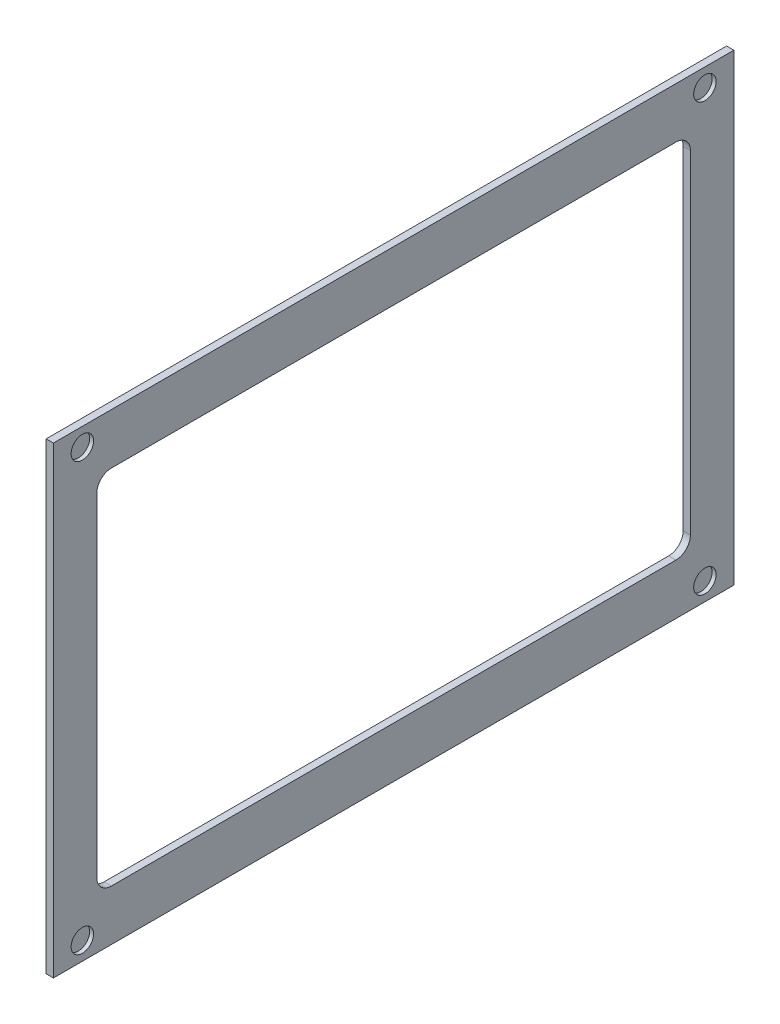
ISO-10303-21;
HEADER;
FILE_DESCRIPTION(('STEP AP214'),'2;1');
FILE_NAME('part.step','',(''),(''),'','','');
FILE_SCHEMA(('AUTOMOTIVE_DESIGN { 1 0 10303 214 1 1 1 1 }'));
ENDSEC;
DATA;
#1=APPLICATION_CONTEXT('core data for automotive mechanical design processes');
#2=APPLICATION_PROTOCOL_DEFINITION('international standard','automotive_design',2000,#1);
#3=PRODUCT_CONTEXT('',#1,'mechanical');
#4=PRODUCT('Part','Part','',(#3));
#5=PRODUCT_RELATED_PRODUCT_CATEGORY('part','',(#4));
#6=PRODUCT_DEFINITION_FORMATION('','',#4);
#7=PRODUCT_DEFINITION_CONTEXT('part definition',#1,'design');
#8=PRODUCT_DEFINITION('design','',#6,#7);
#9=PRODUCT_DEFINITION_SHAPE('','',#8);
#10=(LENGTH_UNIT() NAMED_UNIT(*) SI_UNIT(.MILLI.,.METRE.));
#11=(NAMED_UNIT(*) PLANE_ANGLE_UNIT() SI_UNIT($,.RADIAN.));
#12=(NAMED_UNIT(*) SI_UNIT($,.STERADIAN.) SOLID_ANGLE_UNIT());
#13=UNCERTAINTY_MEASURE_WITH_UNIT(LENGTH_MEASURE(1.E-05),#10,'distance_accuracy_value','');
#14=(GEOMETRIC_REPRESENTATION_CONTEXT(3) GLOBAL_UNCERTAINTY_ASSIGNED_CONTEXT((#13)) GLOBAL_UNIT_ASSIGNED_CONTEXT((#10,
#11,#12)) REPRESENTATION_CONTEXT('',''));
#15=CARTESIAN_POINT('',(0.,0.,0.));
#16=DIRECTION('',(0.,0.,1.));
#17=DIRECTION('',(1.,0.,0.));
#18=AXIS2_PLACEMENT_3D('',#15,#16,#17);
#19=CARTESIAN_POINT('',(2.,102.239203456617,133.672025675722));
#20=DIRECTION('',(0.,0.,-1.));
#21=DIRECTION('',(-1.,0.,0.));
#22=AXIS2_PLACEMENT_3D('',#19,#20,#21);
#23=PLANE('',#22);
#24=DIRECTION('',(0.,-1.,0.));
#25=VECTOR('',#24,1.);
#26=CARTESIAN_POINT('',(0.,102.239203456617,133.672025675722));
#27=LINE('',#26,#25);
#28=CARTESIAN_POINT('',(0.,102.239203456617,133.672025675722));
#29=VERTEX_POINT('',#28);
#30=CARTESIAN_POINT('',(0.,-25.7607965433831,133.672025675722));
#31=VERTEX_POINT('',#30);
#32=EDGE_CURVE('E149',#29,#31,#27,.T.);
#33=ORIENTED_EDGE('',*,*,#32,.T.);
#34=DIRECTION('',(-1.,0.,0.));
#35=VECTOR('',#34,1.);
#36=CARTESIAN_POINT('',(2.,-25.7607965433831,133.672025675722));
#37=LINE('',#36,#35);
#38=CARTESIAN_POINT('',(2.,-25.7607965433831,133.672025675722));
#39=VERTEX_POINT('',#38);
#40=EDGE_CURVE('E130',#39,#31,#37,.T.);
#41=ORIENTED_EDGE('',*,*,#40,.F.);
#42=DIRECTION('',(0.,-1.,0.));
#43=VECTOR('',#42,1.);
#44=CARTESIAN_POINT('',(2.,102.239203456617,133.672025675722));
#45=LINE('',#44,#43);
#46=CARTESIAN_POINT('',(2.,102.239203456617,133.672025675722));
#47=VERTEX_POINT('',#46);
#48=EDGE_CURVE('E137',#47,#39,#45,.T.);
#49=ORIENTED_EDGE('',*,*,#48,.F.);
#50=DIRECTION('',(-1.,0.,0.));
#51=VECTOR('',#50,1.);
#52=CARTESIAN_POINT('',(2.,102.239203456617,133.672025675722));
#53=LINE('',#52,#51);
#54=EDGE_CURVE('E271',#47,#29,#53,.T.);
#55=ORIENTED_EDGE('',*,*,#54,.T.);
#56=EDGE_LOOP('',(#33,#41,#49,#55));
#57=FACE_BOUND('',#56,.T.);
#58=ADVANCED_FACE('F37',(#57),#23,.F.);
#59=CARTESIAN_POINT('',(2.,-25.7607965433831,133.672025675722));
#60=DIRECTION('',(0.,1.,0.));
#61=DIRECTION('',(0.,0.,1.));
#62=AXIS2_PLACEMENT_3D('',#59,#60,#61);
#63=PLANE('',#62);
#64=DIRECTION('',(0.,0.,-1.));
#65=VECTOR('',#64,1.);
#66=CARTESIAN_POINT('',(0.,-25.7607965433831,133.672025675722));
#67=LINE('',#66,#65);
#68=CARTESIAN_POINT('',(0.,-25.7607965433831,-54.3279743242773));
#69=VERTEX_POINT('',#68);
#70=EDGE_CURVE('E273',#31,#69,#67,.T.);
#71=ORIENTED_EDGE('',*,*,#70,.T.);
#72=DIRECTION('',(-1.,0.,0.));
#73=VECTOR('',#72,1.);
#74=CARTESIAN_POINT('',(2.,-25.7607965433831,-54.3279743242773));
#75=LINE('',#74,#73);
#76=CARTESIAN_POINT('',(2.,-25.7607965433831,-54.3279743242773));
#77=VERTEX_POINT('',#76);
#78=EDGE_CURVE('E133',#77,#69,#75,.T.);
#79=ORIENTED_EDGE('',*,*,#78,.F.);
#80=DIRECTION('',(0.,0.,-1.));
#81=VECTOR('',#80,1.);
#82=CARTESIAN_POINT('',(2.,-25.7607965433831,133.672025675722));
#83=LINE('',#82,#81);
#84=EDGE_CURVE('E126',#39,#77,#83,.T.);
#85=ORIENTED_EDGE('',*,*,#84,.F.);
#86=ORIENTED_EDGE('',*,*,#40,.T.);
#87=EDGE_LOOP('',(#71,#79,#85,#86));
#88=FACE_BOUND('',#87,.T.);
#89=ADVANCED_FACE('F128',(#88),#63,.F.);
#90=CARTESIAN_POINT('',(2.,102.239203456617,-54.3279743242773));
#91=DIRECTION('',(0.,0.,1.));
#92=DIRECTION('',(0.,-1.,0.));
#93=AXIS2_PLACEMENT_3D('',#90,#91,#92);
#94=PLANE('',#93);
#95=DIRECTION('',(0.,1.,0.));
#96=VECTOR('',#95,1.);
#97=CARTESIAN_POINT('',(0.,102.239203456617,-54.3279743242773));
#98=LINE('',#97,#96);
#99=CARTESIAN_POINT('',(0.,102.239203456617,-54.3279743242773));
#100=VERTEX_POINT('',#99);
#101=EDGE_CURVE('E275',#69,#100,#98,.T.);
#102=ORIENTED_EDGE('',*,*,#101,.T.);
#103=DIRECTION('',(-1.,0.,0.));
#104=VECTOR('',#103,1.);
#105=CARTESIAN_POINT('',(2.,102.239203456617,-54.3279743242773));
#106=LINE('',#105,#104);
#107=CARTESIAN_POINT('',(2.,102.239203456617,-54.3279743242773));
#108=VERTEX_POINT('',#107);
#109=EDGE_CURVE('E154',#108,#100,#106,.T.);
#110=ORIENTED_EDGE('',*,*,#109,.F.);
#111=DIRECTION('',(0.,1.,0.));
#112=VECTOR('',#111,1.);
#113=CARTESIAN_POINT('',(2.,102.239203456617,-54.3279743242773));
#114=LINE('',#113,#112);
#115=EDGE_CURVE('E136',#77,#108,#114,.T.);
#116=ORIENTED_EDGE('',*,*,#115,.F.);
#117=ORIENTED_EDGE('',*,*,#78,.T.);
#118=EDGE_LOOP('',(#102,#110,#116,#117));
#119=FACE_BOUND('',#118,.T.);
#120=ADVANCED_FACE('F216',(#119),#94,.F.);
#121=CARTESIAN_POINT('',(2.,102.239203456617,133.672025675722));
#122=DIRECTION('',(0.,-1.,0.));
#123=DIRECTION('',(0.,0.,-1.));
#124=AXIS2_PLACEMENT_3D('',#121,#122,#123);
#125=PLANE('',#124);
#126=DIRECTION('',(0.,0.,1.));
#127=VECTOR('',#126,1.);
#128=CARTESIAN_POINT('',(0.,102.239203456617,133.672025675722));
#129=LINE('',#128,#127);
#130=EDGE_CURVE('E146',#100,#29,#129,.T.);
#131=ORIENTED_EDGE('',*,*,#130,.T.);
#132=ORIENTED_EDGE('',*,*,#54,.F.);
#133=DIRECTION('',(0.,0.,1.));
#134=VECTOR('',#133,1.);
#135=CARTESIAN_POINT('',(2.,102.239203456617,133.672025675722));
#136=LINE('',#135,#134);
#137=EDGE_CURVE('E142',#108,#47,#136,.T.);
#138=ORIENTED_EDGE('',*,*,#137,.F.);
#139=ORIENTED_EDGE('',*,*,#109,.T.);
#140=EDGE_LOOP('',(#131,#132,#138,#139));
#141=FACE_BOUND('',#140,.T.);
#142=ADVANCED_FACE('F282',(#141),#125,.F.);
#143=CARTESIAN_POINT('',(2.,0.,0.));
#144=DIRECTION('',(1.,0.,0.));
#145=DIRECTION('',(0.,0.,-1.));
#146=AXIS2_PLACEMENT_3D('',#143,#144,#145);
#147=PLANE('',#146);
#148=DIRECTION('',(0.,-1.,0.));
#149=VECTOR('',#148,1.);
#150=CARTESIAN_POINT('',(2.,0.,121.672025675722));
#151=LINE('',#150,#149);
#152=CARTESIAN_POINT('',(2.,84.2392034566169,121.672025675722));
#153=VERTEX_POINT('',#152);
#154=CARTESIAN_POINT('',(2.,-7.76079654338306,121.672025675722));
#155=VERTEX_POINT('',#154);
#156=EDGE_CURVE('E198',#153,#155,#151,.T.);
#157=ORIENTED_EDGE('',*,*,#156,.F.);
#158=CARTESIAN_POINT('',(2.,84.2392034566169,117.672025675722));
#159=DIRECTION('',(1.,0.,0.));
#160=DIRECTION('',(0.,0.,-1.));
#161=AXIS2_PLACEMENT_3D('',#158,#159,#160);
#162=CIRCLE('',#161,4.);
#163=CARTESIAN_POINT('',(2.,88.2392034566169,117.672025675722));
#164=VERTEX_POINT('',#163);
#165=EDGE_CURVE('E180',#153,#164,#162,.F.);
#166=ORIENTED_EDGE('',*,*,#165,.T.);
#167=DIRECTION('',(0.,0.,1.));
#168=VECTOR('',#167,1.);
#169=CARTESIAN_POINT('',(2.,88.2392034566169,0.));
#170=LINE('',#169,#168);
#171=CARTESIAN_POINT('',(2.,88.2392034566169,-38.3279743242773));
#172=VERTEX_POINT('',#171);
#173=EDGE_CURVE('E234',#172,#164,#170,.T.);
#174=ORIENTED_EDGE('',*,*,#173,.F.);
#175=CARTESIAN_POINT('',(2.,84.2392034566169,-38.3279743242773));
#176=DIRECTION('',(1.,0.,0.));
#177=DIRECTION('',(0.,0.,-1.));
#178=AXIS2_PLACEMENT_3D('',#175,#176,#177);
#179=CIRCLE('',#178,4.);
#180=CARTESIAN_POINT('',(2.,84.2392034566169,-42.3279743242773));
#181=VERTEX_POINT('',#180);
#182=EDGE_CURVE('E176',#172,#181,#179,.F.);
#183=ORIENTED_EDGE('',*,*,#182,.T.);
#184=DIRECTION('',(0.,1.,0.));
#185=VECTOR('',#184,1.);
#186=CARTESIAN_POINT('',(2.,0.,-42.3279743242773));
#187=LINE('',#186,#185);
#188=CARTESIAN_POINT('',(2.,-7.76079654338307,-42.3279743242773));
#189=VERTEX_POINT('',#188);
#190=EDGE_CURVE('E194',#189,#181,#187,.T.);
#191=ORIENTED_EDGE('',*,*,#190,.F.);
#192=CARTESIAN_POINT('',(2.,-7.76079654338307,-38.3279743242773));
#193=DIRECTION('',(1.,0.,0.));
#194=DIRECTION('',(0.,0.,-1.));
#195=AXIS2_PLACEMENT_3D('',#192,#193,#194);
#196=CIRCLE('',#195,4.);
#197=CARTESIAN_POINT('',(2.,-11.7607965433831,-38.3279743242773));
#198=VERTEX_POINT('',#197);
#199=EDGE_CURVE('E183',#189,#198,#196,.F.);
#200=ORIENTED_EDGE('',*,*,#199,.T.);
#201=DIRECTION('',(0.,0.,-1.));
#202=VECTOR('',#201,1.);
#203=CARTESIAN_POINT('',(2.,-11.7607965433831,0.));
#204=LINE('',#203,#202);
#205=CARTESIAN_POINT('',(2.,-11.7607965433831,117.672025675722));
#206=VERTEX_POINT('',#205);
#207=EDGE_CURVE('E191',#206,#198,#204,.T.);
#208=ORIENTED_EDGE('',*,*,#207,.F.);
#209=CARTESIAN_POINT('',(2.,-7.76079654338306,117.672025675722));
#210=DIRECTION('',(1.,0.,0.));
#211=DIRECTION('',(0.,0.,-1.));
#212=AXIS2_PLACEMENT_3D('',#209,#210,#211);
#213=CIRCLE('',#212,4.);
#214=EDGE_CURVE('E11',#206,#155,#213,.F.);
#215=ORIENTED_EDGE('',*,*,#214,.T.);
#216=EDGE_LOOP('',(#157,#166,#174,#183,#191,#200,#208,#215));
#217=FACE_BOUND('',#216,.T.);
#218=CARTESIAN_POINT('',(2.,97.2392034566169,-46.3279743242773));
#219=DIRECTION('',(1.,0.,0.));
#220=DIRECTION('',(0.,0.,-1.));
#221=AXIS2_PLACEMENT_3D('',#218,#219,#220);
#222=CIRCLE('',#221,3.1);
#223=CARTESIAN_POINT('',(2.,97.2392034566169,-49.4279743242773));
#224=VERTEX_POINT('',#223);
#225=EDGE_CURVE('E256',#224,#224,#222,.T.);
#226=ORIENTED_EDGE('',*,*,#225,.F.);
#227=EDGE_LOOP('',(#226));
#228=FACE_BOUND('',#227,.T.);
#229=CARTESIAN_POINT('',(2.,-20.7607965433831,125.672025675722));
#230=DIRECTION('',(1.,0.,0.));
#231=DIRECTION('',(0.,0.,-1.));
#232=AXIS2_PLACEMENT_3D('',#229,#230,#231);
#233=CIRCLE('',#232,3.09999999999999);
#234=CARTESIAN_POINT('',(2.,-20.7607965433831,122.572025675722));
#235=VERTEX_POINT('',#234);
#236=EDGE_CURVE('E249',#235,#235,#233,.T.);
#237=ORIENTED_EDGE('',*,*,#236,.F.);
#238=EDGE_LOOP('',(#237));
#239=FACE_BOUND('',#238,.T.);
#240=CARTESIAN_POINT('',(2.,-20.7607965433831,-46.3279743242773));
#241=DIRECTION('',(1.,0.,0.));
#242=DIRECTION('',(0.,0.,-1.));
#243=AXIS2_PLACEMENT_3D('',#240,#241,#242);
#244=CIRCLE('',#243,3.09999999999999);
#245=CARTESIAN_POINT('',(2.,-20.7607965433831,-49.4279743242773));
#246=VERTEX_POINT('',#245);
#247=EDGE_CURVE('E245',#246,#246,#244,.T.);
#248=ORIENTED_EDGE('',*,*,#247,.F.);
#249=EDGE_LOOP('',(#248));
#250=FACE_BOUND('',#249,.T.);
#251=CARTESIAN_POINT('',(2.,97.2392034566169,125.672025675722));
#252=DIRECTION('',(1.,0.,0.));
#253=DIRECTION('',(0.,0.,-1.));
#254=AXIS2_PLACEMENT_3D('',#251,#252,#253);
#255=CIRCLE('',#254,3.09999999999999);
#256=CARTESIAN_POINT('',(2.,97.2392034566169,122.572025675722));
#257=VERTEX_POINT('',#256);
#258=EDGE_CURVE('E255',#257,#257,#255,.T.);
#259=ORIENTED_EDGE('',*,*,#258,.F.);
#260=EDGE_LOOP('',(#259));
#261=FACE_BOUND('',#260,.T.);
#262=ORIENTED_EDGE('',*,*,#48,.T.);
#263=ORIENTED_EDGE('',*,*,#84,.T.);
#264=ORIENTED_EDGE('',*,*,#115,.T.);
#265=ORIENTED_EDGE('',*,*,#137,.T.);
#266=EDGE_LOOP('',(#262,#263,#264,#265));
#267=FACE_BOUND('',#266,.T.);
#268=ADVANCED_FACE('F140',(#217,#228,#239,#250,#261,#267),#147,.T.);
#269=CARTESIAN_POINT('',(0.,0.,0.));
#270=DIRECTION('',(1.,0.,0.));
#271=DIRECTION('',(0.,0.,-1.));
#272=AXIS2_PLACEMENT_3D('',#269,#270,#271);
#273=PLANE('',#272);
#274=DIRECTION('',(0.,0.,-1.));
#275=VECTOR('',#274,1.);
#276=CARTESIAN_POINT('',(0.,88.2392034566169,121.672025675722));
#277=LINE('',#276,#275);
#278=CARTESIAN_POINT('',(0.,88.2392034566169,117.672025675722));
#279=VERTEX_POINT('',#278);
#280=CARTESIAN_POINT('',(0.,88.2392034566169,-38.3279743242773));
#281=VERTEX_POINT('',#280);
#282=EDGE_CURVE('E464',#279,#281,#277,.T.);
#283=ORIENTED_EDGE('',*,*,#282,.F.);
#284=CARTESIAN_POINT('',(0.,84.2392034566169,117.672025675722));
#285=DIRECTION('',(1.,0.,0.));
#286=DIRECTION('',(0.,0.,-1.));
#287=AXIS2_PLACEMENT_3D('',#284,#285,#286);
#288=CIRCLE('',#287,4.);
#289=CARTESIAN_POINT('',(0.,84.2392034566169,121.672025675722));
#290=VERTEX_POINT('',#289);
#291=EDGE_CURVE('E178',#279,#290,#288,.T.);
#292=ORIENTED_EDGE('',*,*,#291,.T.);
#293=DIRECTION('',(0.,1.,0.));
#294=VECTOR('',#293,1.);
#295=CARTESIAN_POINT('',(0.,-11.7607965433831,121.672025675722));
#296=LINE('',#295,#294);
#297=CARTESIAN_POINT('',(0.,-7.76079654338306,121.672025675722));
#298=VERTEX_POINT('',#297);
#299=EDGE_CURVE('E461',#298,#290,#296,.T.);
#300=ORIENTED_EDGE('',*,*,#299,.F.);
#301=CARTESIAN_POINT('',(0.,-7.76079654338306,117.672025675722));
#302=DIRECTION('',(1.,0.,0.));
#303=DIRECTION('',(0.,0.,-1.));
#304=AXIS2_PLACEMENT_3D('',#301,#302,#303);
#305=CIRCLE('',#304,4.);
#306=CARTESIAN_POINT('',(0.,-11.7607965433831,117.672025675722));
#307=VERTEX_POINT('',#306);
#308=EDGE_CURVE('E45',#298,#307,#305,.T.);
#309=ORIENTED_EDGE('',*,*,#308,.T.);
#310=DIRECTION('',(0.,0.,1.));
#311=VECTOR('',#310,1.);
#312=CARTESIAN_POINT('',(0.,-11.7607965433831,121.672025675722));
#313=LINE('',#312,#311);
#314=CARTESIAN_POINT('',(0.,-11.7607965433831,-38.3279743242773));
#315=VERTEX_POINT('',#314);
#316=EDGE_CURVE('E239',#315,#307,#313,.T.);
#317=ORIENTED_EDGE('',*,*,#316,.F.);
#318=CARTESIAN_POINT('',(0.,-7.76079654338307,-38.3279743242773));
#319=DIRECTION('',(1.,0.,0.));
#320=DIRECTION('',(0.,0.,-1.));
#321=AXIS2_PLACEMENT_3D('',#318,#319,#320);
#322=CIRCLE('',#321,4.);
#323=CARTESIAN_POINT('',(0.,-7.76079654338307,-42.3279743242773));
#324=VERTEX_POINT('',#323);
#325=EDGE_CURVE('E59',#315,#324,#322,.T.);
#326=ORIENTED_EDGE('',*,*,#325,.T.);
#327=DIRECTION('',(0.,-1.,0.));
#328=VECTOR('',#327,1.);
#329=CARTESIAN_POINT('',(0.,-11.7607965433831,-42.3279743242773));
#330=LINE('',#329,#328);
#331=CARTESIAN_POINT('',(0.,84.2392034566169,-42.3279743242773));
#332=VERTEX_POINT('',#331);
#333=EDGE_CURVE('E470',#332,#324,#330,.T.);
#334=ORIENTED_EDGE('',*,*,#333,.F.);
#335=CARTESIAN_POINT('',(0.,84.2392034566169,-38.3279743242773));
#336=DIRECTION('',(1.,0.,0.));
#337=DIRECTION('',(0.,0.,-1.));
#338=AXIS2_PLACEMENT_3D('',#335,#336,#337);
#339=CIRCLE('',#338,4.);
#340=EDGE_CURVE('E174',#332,#281,#339,.T.);
#341=ORIENTED_EDGE('',*,*,#340,.T.);
#342=EDGE_LOOP('',(#283,#292,#300,#309,#317,#326,#334,#341));
#343=FACE_BOUND('',#342,.T.);
#344=ORIENTED_EDGE('',*,*,#32,.F.);
#345=ORIENTED_EDGE('',*,*,#130,.F.);
#346=ORIENTED_EDGE('',*,*,#101,.F.);
#347=ORIENTED_EDGE('',*,*,#70,.F.);
#348=EDGE_LOOP('',(#344,#345,#346,#347));
#349=FACE_BOUND('',#348,.T.);
#350=ADVANCED_FACE('F286',(#343,#349),#273,.F.);
#351=CARTESIAN_POINT('',(0.9,97.2392034566169,125.672025675722));
#352=DIRECTION('',(1.,0.,0.));
#353=DIRECTION('',(0.,0.,-1.));
#354=AXIS2_PLACEMENT_3D('',#351,#352,#353);
#355=CYLINDRICAL_SURFACE('',#354,3.09999999999999);
#356=CARTESIAN_POINT('',(0.9,97.2392034566169,125.672025675722));
#357=DIRECTION('',(1.,0.,0.));
#358=DIRECTION('',(0.,0.,-1.));
#359=AXIS2_PLACEMENT_3D('',#356,#357,#358);
#360=CIRCLE('',#359,3.09999999999999);
#361=CARTESIAN_POINT('',(0.9,97.2392034566169,122.572025675722));
#362=VERTEX_POINT('',#361);
#363=EDGE_CURVE('E264',#362,#362,#360,.T.);
#364=ORIENTED_EDGE('',*,*,#363,.F.);
#365=EDGE_LOOP('',(#364));
#366=FACE_BOUND('',#365,.T.);
#367=ORIENTED_EDGE('',*,*,#258,.T.);
#368=EDGE_LOOP('',(#367));
#369=FACE_BOUND('',#368,.T.);
#370=ADVANCED_FACE('F295',(#366,#369),#355,.F.);
#371=CARTESIAN_POINT('',(0.9,97.2392034566169,125.672025675722));
#372=DIRECTION('',(1.,0.,0.));
#373=DIRECTION('',(0.,0.,-1.));
#374=AXIS2_PLACEMENT_3D('',#371,#372,#373);
#375=PLANE('',#374);
#376=ORIENTED_EDGE('',*,*,#363,.T.);
#377=EDGE_LOOP('',(#376));
#378=FACE_BOUND('',#377,.T.);
#379=ADVANCED_FACE('F300',(#378),#375,.T.);
#380=CARTESIAN_POINT('',(0.9,-20.7607965433831,-46.3279743242773));
#381=DIRECTION('',(1.,0.,0.));
#382=DIRECTION('',(0.,0.,-1.));
#383=AXIS2_PLACEMENT_3D('',#380,#381,#382);
#384=CYLINDRICAL_SURFACE('',#383,3.09999999999999);
#385=CARTESIAN_POINT('',(0.9,-20.7607965433831,-46.3279743242773));
#386=DIRECTION('',(1.,0.,0.));
#387=DIRECTION('',(0.,0.,-1.));
#388=AXIS2_PLACEMENT_3D('',#385,#386,#387);
#389=CIRCLE('',#388,3.09999999999999);
#390=CARTESIAN_POINT('',(0.9,-20.7607965433831,-49.4279743242773));
#391=VERTEX_POINT('',#390);
#392=EDGE_CURVE('E246',#391,#391,#389,.T.);
#393=ORIENTED_EDGE('',*,*,#392,.F.);
#394=EDGE_LOOP('',(#393));
#395=FACE_BOUND('',#394,.T.);
#396=ORIENTED_EDGE('',*,*,#247,.T.);
#397=EDGE_LOOP('',(#396));
#398=FACE_BOUND('',#397,.T.);
#399=ADVANCED_FACE('F304',(#395,#398),#384,.F.);
#400=CARTESIAN_POINT('',(0.9,-20.7607965433831,-46.3279743242773));
#401=DIRECTION('',(1.,0.,0.));
#402=DIRECTION('',(0.,0.,-1.));
#403=AXIS2_PLACEMENT_3D('',#400,#401,#402);
#404=PLANE('',#403);
#405=ORIENTED_EDGE('',*,*,#392,.T.);
#406=EDGE_LOOP('',(#405));
#407=FACE_BOUND('',#406,.T.);
#408=ADVANCED_FACE('F310',(#407),#404,.T.);
#409=CARTESIAN_POINT('',(0.9,-20.7607965433831,125.672025675722));
#410=DIRECTION('',(1.,0.,0.));
#411=DIRECTION('',(0.,0.,-1.));
#412=AXIS2_PLACEMENT_3D('',#409,#410,#411);
#413=CYLINDRICAL_SURFACE('',#412,3.09999999999999);
#414=CARTESIAN_POINT('',(0.9,-20.7607965433831,125.672025675722));
#415=DIRECTION('',(1.,0.,0.));
#416=DIRECTION('',(0.,0.,-1.));
#417=AXIS2_PLACEMENT_3D('',#414,#415,#416);
#418=CIRCLE('',#417,3.09999999999999);
#419=CARTESIAN_POINT('',(0.9,-20.7607965433831,122.572025675722));
#420=VERTEX_POINT('',#419);
#421=EDGE_CURVE('E259',#420,#420,#418,.T.);
#422=ORIENTED_EDGE('',*,*,#421,.F.);
#423=EDGE_LOOP('',(#422));
#424=FACE_BOUND('',#423,.T.);
#425=ORIENTED_EDGE('',*,*,#236,.T.);
#426=EDGE_LOOP('',(#425));
#427=FACE_BOUND('',#426,.T.);
#428=ADVANCED_FACE('F306',(#424,#427),#413,.F.);
#429=CARTESIAN_POINT('',(0.9,-20.7607965433831,125.672025675722));
#430=DIRECTION('',(1.,0.,0.));
#431=DIRECTION('',(0.,0.,-1.));
#432=AXIS2_PLACEMENT_3D('',#429,#430,#431);
#433=PLANE('',#432);
#434=ORIENTED_EDGE('',*,*,#421,.T.);
#435=EDGE_LOOP('',(#434));
#436=FACE_BOUND('',#435,.T.);
#437=ADVANCED_FACE('F309',(#436),#433,.T.);
#438=CARTESIAN_POINT('',(0.9,97.2392034566169,-46.3279743242773));
#439=DIRECTION('',(1.,0.,0.));
#440=DIRECTION('',(0.,0.,-1.));
#441=AXIS2_PLACEMENT_3D('',#438,#439,#440);
#442=CYLINDRICAL_SURFACE('',#441,3.1);
#443=CARTESIAN_POINT('',(0.9,97.2392034566169,-46.3279743242773));
#444=DIRECTION('',(1.,0.,0.));
#445=DIRECTION('',(0.,0.,-1.));
#446=AXIS2_PLACEMENT_3D('',#443,#444,#445);
#447=CIRCLE('',#446,3.1);
#448=CARTESIAN_POINT('',(0.9,97.2392034566169,-49.4279743242773));
#449=VERTEX_POINT('',#448);
#450=EDGE_CURVE('E252',#449,#449,#447,.T.);
#451=ORIENTED_EDGE('',*,*,#450,.F.);
#452=EDGE_LOOP('',(#451));
#453=FACE_BOUND('',#452,.T.);
#454=ORIENTED_EDGE('',*,*,#225,.T.);
#455=EDGE_LOOP('',(#454));
#456=FACE_BOUND('',#455,.T.);
#457=ADVANCED_FACE('F314',(#453,#456),#442,.F.);
#458=CARTESIAN_POINT('',(0.9,97.2392034566169,-46.3279743242773));
#459=DIRECTION('',(1.,0.,0.));
#460=DIRECTION('',(0.,0.,-1.));
#461=AXIS2_PLACEMENT_3D('',#458,#459,#460);
#462=PLANE('',#461);
#463=ORIENTED_EDGE('',*,*,#450,.T.);
#464=EDGE_LOOP('',(#463));
#465=FACE_BOUND('',#464,.T.);
#466=ADVANCED_FACE('F318',(#465),#462,.T.);
#467=CARTESIAN_POINT('',(10.,-11.7607965433831,121.672025675722));
#468=DIRECTION('',(0.,0.,1.));
#469=DIRECTION('',(1.,0.,0.));
#470=AXIS2_PLACEMENT_3D('',#467,#468,#469);
#471=PLANE('',#470);
#472=ORIENTED_EDGE('',*,*,#299,.T.);
#473=DIRECTION('',(-1.,0.,0.));
#474=VECTOR('',#473,1.);
#475=CARTESIAN_POINT('',(2.,84.2392034566169,121.672025675722));
#476=LINE('',#475,#474);
#477=EDGE_CURVE('E168',#290,#153,#476,.F.);
#478=ORIENTED_EDGE('',*,*,#477,.T.);
#479=ORIENTED_EDGE('',*,*,#156,.T.);
#480=DIRECTION('',(-1.,0.,0.));
#481=VECTOR('',#480,1.);
#482=CARTESIAN_POINT('',(0.,-7.76079654338306,121.672025675722));
#483=LINE('',#482,#481);
#484=EDGE_CURVE('E165',#155,#298,#483,.T.);
#485=ORIENTED_EDGE('',*,*,#484,.T.);
#486=EDGE_LOOP('',(#472,#478,#479,#485));
#487=FACE_BOUND('',#486,.T.);
#488=ADVANCED_FACE('F322',(#487),#471,.F.);
#489=CARTESIAN_POINT('',(10.,-11.7607965433831,121.672025675722));
#490=DIRECTION('',(0.,-1.,0.));
#491=DIRECTION('',(0.,0.,-1.));
#492=AXIS2_PLACEMENT_3D('',#489,#490,#491);
#493=PLANE('',#492);
#494=ORIENTED_EDGE('',*,*,#207,.T.);
#495=DIRECTION('',(-1.,0.,0.));
#496=VECTOR('',#495,1.);
#497=CARTESIAN_POINT('',(0.,-11.7607965433831,-38.3279743242773));
#498=LINE('',#497,#496);
#499=EDGE_CURVE('E172',#198,#315,#498,.T.);
#500=ORIENTED_EDGE('',*,*,#499,.T.);
#501=ORIENTED_EDGE('',*,*,#316,.T.);
#502=DIRECTION('',(-1.,0.,0.));
#503=VECTOR('',#502,1.);
#504=CARTESIAN_POINT('',(2.,-11.7607965433831,117.672025675722));
#505=LINE('',#504,#503);
#506=EDGE_CURVE('E170',#307,#206,#505,.F.);
#507=ORIENTED_EDGE('',*,*,#506,.T.);
#508=EDGE_LOOP('',(#494,#500,#501,#507));
#509=FACE_BOUND('',#508,.T.);
#510=ADVANCED_FACE('F196',(#509),#493,.F.);
#511=CARTESIAN_POINT('',(10.,-11.7607965433831,-42.3279743242773));
#512=DIRECTION('',(0.,0.,-1.));
#513=DIRECTION('',(-1.,0.,0.));
#514=AXIS2_PLACEMENT_3D('',#511,#512,#513);
#515=PLANE('',#514);
#516=ORIENTED_EDGE('',*,*,#190,.T.);
#517=DIRECTION('',(-1.,0.,0.));
#518=VECTOR('',#517,1.);
#519=CARTESIAN_POINT('',(0.,84.2392034566169,-42.3279743242773));
#520=LINE('',#519,#518);
#521=EDGE_CURVE('E152',#181,#332,#520,.T.);
#522=ORIENTED_EDGE('',*,*,#521,.T.);
#523=ORIENTED_EDGE('',*,*,#333,.T.);
#524=DIRECTION('',(-1.,0.,0.));
#525=VECTOR('',#524,1.);
#526=CARTESIAN_POINT('',(2.,-7.76079654338307,-42.3279743242773));
#527=LINE('',#526,#525);
#528=EDGE_CURVE('E150',#324,#189,#527,.F.);
#529=ORIENTED_EDGE('',*,*,#528,.T.);
#530=EDGE_LOOP('',(#516,#522,#523,#529));
#531=FACE_BOUND('',#530,.T.);
#532=ADVANCED_FACE('F226',(#531),#515,.F.);
#533=CARTESIAN_POINT('',(10.,88.2392034566169,121.672025675722));
#534=DIRECTION('',(0.,1.,0.));
#535=DIRECTION('',(0.,0.,1.));
#536=AXIS2_PLACEMENT_3D('',#533,#534,#535);
#537=PLANE('',#536);
#538=ORIENTED_EDGE('',*,*,#282,.T.);
#539=DIRECTION('',(-1.,0.,0.));
#540=VECTOR('',#539,1.);
#541=CARTESIAN_POINT('',(2.,88.2392034566169,-38.3279743242773));
#542=LINE('',#541,#540);
#543=EDGE_CURVE('E163',#281,#172,#542,.F.);
#544=ORIENTED_EDGE('',*,*,#543,.T.);
#545=ORIENTED_EDGE('',*,*,#173,.T.);
#546=DIRECTION('',(-1.,0.,0.));
#547=VECTOR('',#546,1.);
#548=CARTESIAN_POINT('',(0.,88.2392034566169,117.672025675722));
#549=LINE('',#548,#547);
#550=EDGE_CURVE('E160',#164,#279,#549,.T.);
#551=ORIENTED_EDGE('',*,*,#550,.T.);
#552=EDGE_LOOP('',(#538,#544,#545,#551));
#553=FACE_BOUND('',#552,.T.);
#554=ADVANCED_FACE('F221',(#553),#537,.F.);
#555=CARTESIAN_POINT('',(10.,84.2392034566169,-38.3279743242773));
#556=DIRECTION('',(1.,0.,0.));
#557=DIRECTION('',(0.,0.,-1.));
#558=AXIS2_PLACEMENT_3D('',#555,#556,#557);
#559=CYLINDRICAL_SURFACE('',#558,4.);
#560=ORIENTED_EDGE('',*,*,#182,.F.);
#561=ORIENTED_EDGE('',*,*,#543,.F.);
#562=ORIENTED_EDGE('',*,*,#340,.F.);
#563=ORIENTED_EDGE('',*,*,#521,.F.);
#564=EDGE_LOOP('',(#560,#561,#562,#563));
#565=FACE_BOUND('',#564,.T.);
#566=ADVANCED_FACE('F208',(#565),#559,.F.);
#567=CARTESIAN_POINT('',(10.,84.2392034566169,117.672025675722));
#568=DIRECTION('',(1.,0.,0.));
#569=DIRECTION('',(0.,0.,-1.));
#570=AXIS2_PLACEMENT_3D('',#567,#568,#569);
#571=CYLINDRICAL_SURFACE('',#570,4.);
#572=ORIENTED_EDGE('',*,*,#165,.F.);
#573=ORIENTED_EDGE('',*,*,#477,.F.);
#574=ORIENTED_EDGE('',*,*,#291,.F.);
#575=ORIENTED_EDGE('',*,*,#550,.F.);
#576=EDGE_LOOP('',(#572,#573,#574,#575));
#577=FACE_BOUND('',#576,.T.);
#578=ADVANCED_FACE('F202',(#577),#571,.F.);
#579=CARTESIAN_POINT('',(10.,-7.76079654338307,-38.3279743242773));
#580=DIRECTION('',(1.,0.,0.));
#581=DIRECTION('',(0.,0.,-1.));
#582=AXIS2_PLACEMENT_3D('',#579,#580,#581);
#583=CYLINDRICAL_SURFACE('',#582,4.);
#584=ORIENTED_EDGE('',*,*,#199,.F.);
#585=ORIENTED_EDGE('',*,*,#528,.F.);
#586=ORIENTED_EDGE('',*,*,#325,.F.);
#587=ORIENTED_EDGE('',*,*,#499,.F.);
#588=EDGE_LOOP('',(#584,#585,#586,#587));
#589=FACE_BOUND('',#588,.T.);
#590=ADVANCED_FACE('F200',(#589),#583,.F.);
#591=CARTESIAN_POINT('',(10.,-7.76079654338306,117.672025675722));
#592=DIRECTION('',(1.,0.,0.));
#593=DIRECTION('',(0.,0.,-1.));
#594=AXIS2_PLACEMENT_3D('',#591,#592,#593);
#595=CYLINDRICAL_SURFACE('',#594,4.);
#596=ORIENTED_EDGE('',*,*,#214,.F.);
#597=ORIENTED_EDGE('',*,*,#506,.F.);
#598=ORIENTED_EDGE('',*,*,#308,.F.);
#599=ORIENTED_EDGE('',*,*,#484,.F.);
#600=EDGE_LOOP('',(#596,#597,#598,#599));
#601=FACE_BOUND('',#600,.T.);
#602=ADVANCED_FACE('F39',(#601),#595,.F.);
#603=CLOSED_SHELL('',(#58,#89,#120,#142,#268,#350,#370,#379,#399,#408,#428,#437,#457,#466,#488,
#510,#532,#554,#566,#578,#590,#602));
#604=MANIFOLD_SOLID_BREP('B2',#603);
#605=ADVANCED_BREP_SHAPE_REPRESENTATION('',(#18,#604),#14);
#606=SHAPE_DEFINITION_REPRESENTATION(#9,#605);
ENDSEC;
END-ISO-10303-21;
